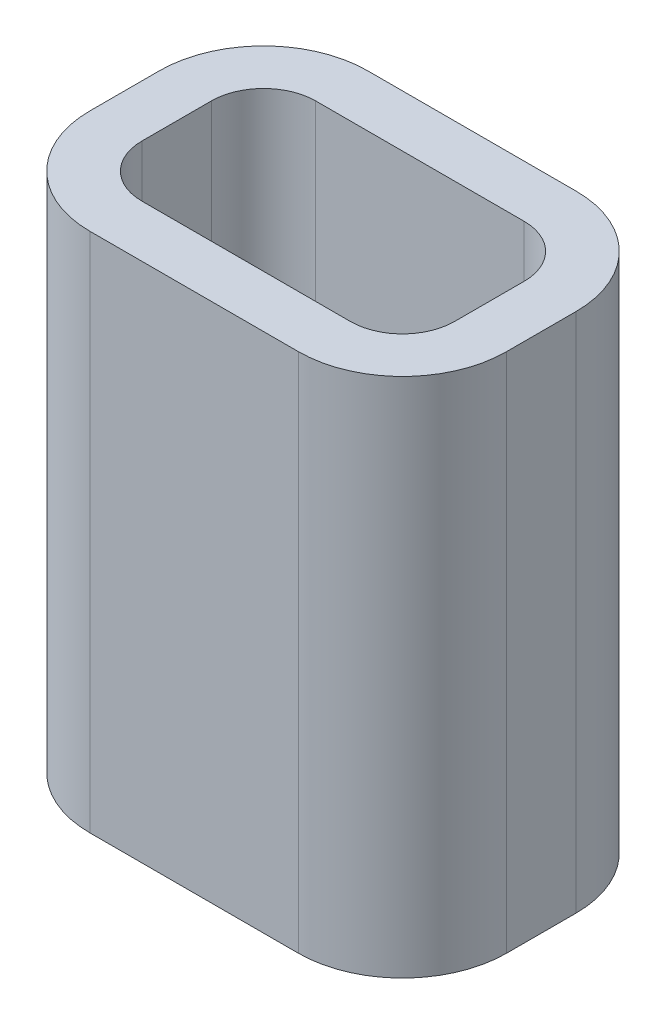
ISO-10303-21;
HEADER;
FILE_DESCRIPTION(('STEP AP214'),'2;1');
FILE_NAME('part.step','',(''),(''),'','','');
FILE_SCHEMA(('AUTOMOTIVE_DESIGN { 1 0 10303 214 1 1 1 1 }'));
ENDSEC;
DATA;
#1=APPLICATION_CONTEXT('core data for automotive mechanical design processes');
#2=APPLICATION_PROTOCOL_DEFINITION('international standard','automotive_design',2000,#1);
#3=PRODUCT_CONTEXT('',#1,'mechanical');
#4=PRODUCT('Part','Part','',(#3));
#5=PRODUCT_RELATED_PRODUCT_CATEGORY('part','',(#4));
#6=PRODUCT_DEFINITION_FORMATION('','',#4);
#7=PRODUCT_DEFINITION_CONTEXT('part definition',#1,'design');
#8=PRODUCT_DEFINITION('design','',#6,#7);
#9=PRODUCT_DEFINITION_SHAPE('','',#8);
#10=(LENGTH_UNIT() NAMED_UNIT(*) SI_UNIT(.MILLI.,.METRE.));
#11=(NAMED_UNIT(*) PLANE_ANGLE_UNIT() SI_UNIT($,.RADIAN.));
#12=(NAMED_UNIT(*) SI_UNIT($,.STERADIAN.) SOLID_ANGLE_UNIT());
#13=UNCERTAINTY_MEASURE_WITH_UNIT(LENGTH_MEASURE(1.E-05),#10,'distance_accuracy_value','');
#14=(GEOMETRIC_REPRESENTATION_CONTEXT(3) GLOBAL_UNCERTAINTY_ASSIGNED_CONTEXT((#13)) GLOBAL_UNIT_ASSIGNED_CONTEXT((#10,
#11,#12)) REPRESENTATION_CONTEXT('',''));
#15=CARTESIAN_POINT('',(0.,0.,0.));
#16=DIRECTION('',(0.,0.,1.));
#17=DIRECTION('',(1.,0.,0.));
#18=AXIS2_PLACEMENT_3D('',#15,#16,#17);
#19=CARTESIAN_POINT('',(6.00000000000001,30.,-2.));
#20=DIRECTION('',(0.,-1.,0.));
#21=DIRECTION('',(0.,0.,-1.));
#22=AXIS2_PLACEMENT_3D('',#19,#20,#21);
#23=CYLINDRICAL_SURFACE('',#22,3.);
#24=DIRECTION('',(0.,-1.,0.));
#25=VECTOR('',#24,1.);
#26=CARTESIAN_POINT('',(5.99999999999999,30.,-5.));
#27=LINE('',#26,#25);
#28=CARTESIAN_POINT('',(5.99999999999999,30.,-5.));
#29=VERTEX_POINT('',#28);
#30=CARTESIAN_POINT('',(5.99999999999999,1.,-5.));
#31=VERTEX_POINT('',#30);
#32=EDGE_CURVE('E188',#29,#31,#27,.T.);
#33=ORIENTED_EDGE('',*,*,#32,.T.);
#34=CARTESIAN_POINT('',(6.00000000000001,1.,-2.));
#35=DIRECTION('',(0.,-1.,0.));
#36=DIRECTION('',(0.,0.,-1.));
#37=AXIS2_PLACEMENT_3D('',#34,#35,#36);
#38=CIRCLE('',#37,3.);
#39=CARTESIAN_POINT('',(9.00000000000001,1.,-1.99999999999998));
#40=VERTEX_POINT('',#39);
#41=EDGE_CURVE('E176',#31,#40,#38,.T.);
#42=ORIENTED_EDGE('',*,*,#41,.T.);
#43=DIRECTION('',(0.,-1.,0.));
#44=VECTOR('',#43,1.);
#45=CARTESIAN_POINT('',(9.00000000000001,30.,-1.99999999999998));
#46=LINE('',#45,#44);
#47=CARTESIAN_POINT('',(9.00000000000001,30.,-1.99999999999998));
#48=VERTEX_POINT('',#47);
#49=EDGE_CURVE('E185',#48,#40,#46,.T.);
#50=ORIENTED_EDGE('',*,*,#49,.F.);
#51=CARTESIAN_POINT('',(6.00000000000001,30.,-2.));
#52=DIRECTION('',(0.,1.,0.));
#53=DIRECTION('',(0.,0.,-1.));
#54=AXIS2_PLACEMENT_3D('',#51,#52,#53);
#55=CIRCLE('',#54,3.);
#56=EDGE_CURVE('E390',#48,#29,#55,.T.);
#57=ORIENTED_EDGE('',*,*,#56,.T.);
#58=EDGE_LOOP('',(#33,#42,#50,#57));
#59=FACE_BOUND('',#58,.T.);
#60=ADVANCED_FACE('F39',(#59),#23,.F.);
#61=CARTESIAN_POINT('',(-5.99999999999997,30.,-5.));
#62=DIRECTION('',(0.,0.,1.));
#63=DIRECTION('',(1.,0.,0.));
#64=AXIS2_PLACEMENT_3D('',#61,#62,#63);
#65=PLANE('',#64);
#66=DIRECTION('',(0.,-1.,0.));
#67=VECTOR('',#66,1.);
#68=CARTESIAN_POINT('',(-5.99999999999997,30.,-5.));
#69=LINE('',#68,#67);
#70=CARTESIAN_POINT('',(-5.99999999999997,30.,-5.));
#71=VERTEX_POINT('',#70);
#72=CARTESIAN_POINT('',(-5.99999999999997,1.,-5.));
#73=VERTEX_POINT('',#72);
#74=EDGE_CURVE('E212',#71,#73,#69,.T.);
#75=ORIENTED_EDGE('',*,*,#74,.T.);
#76=DIRECTION('',(1.,0.,0.));
#77=VECTOR('',#76,1.);
#78=CARTESIAN_POINT('',(5.99999999999999,1.,-5.));
#79=LINE('',#78,#77);
#80=EDGE_CURVE('E416',#73,#31,#79,.T.);
#81=ORIENTED_EDGE('',*,*,#80,.T.);
#82=ORIENTED_EDGE('',*,*,#32,.F.);
#83=DIRECTION('',(-1.,0.,0.));
#84=VECTOR('',#83,1.);
#85=CARTESIAN_POINT('',(-5.99999999999997,30.,-5.));
#86=LINE('',#85,#84);
#87=EDGE_CURVE('E383',#29,#71,#86,.T.);
#88=ORIENTED_EDGE('',*,*,#87,.T.);
#89=EDGE_LOOP('',(#75,#81,#82,#88));
#90=FACE_BOUND('',#89,.T.);
#91=ADVANCED_FACE('F320',(#90),#65,.T.);
#92=CARTESIAN_POINT('',(-5.99999999999999,30.,-2.));
#93=DIRECTION('',(0.,-1.,0.));
#94=DIRECTION('',(0.,0.,-1.));
#95=AXIS2_PLACEMENT_3D('',#92,#93,#94);
#96=CYLINDRICAL_SURFACE('',#95,3.);
#97=DIRECTION('',(0.,-1.,0.));
#98=VECTOR('',#97,1.);
#99=CARTESIAN_POINT('',(-8.99999999999999,30.,-1.99999999999998));
#100=LINE('',#99,#98);
#101=CARTESIAN_POINT('',(-8.99999999999999,30.,-1.99999999999998));
#102=VERTEX_POINT('',#101);
#103=CARTESIAN_POINT('',(-8.99999999999999,1.,-1.99999999999998));
#104=VERTEX_POINT('',#103);
#105=EDGE_CURVE('E209',#102,#104,#100,.T.);
#106=ORIENTED_EDGE('',*,*,#105,.T.);
#107=CARTESIAN_POINT('',(-5.99999999999999,1.,-2.));
#108=DIRECTION('',(0.,-1.,0.));
#109=DIRECTION('',(0.,0.,-1.));
#110=AXIS2_PLACEMENT_3D('',#107,#108,#109);
#111=CIRCLE('',#110,3.);
#112=EDGE_CURVE('E368',#104,#73,#111,.T.);
#113=ORIENTED_EDGE('',*,*,#112,.T.);
#114=ORIENTED_EDGE('',*,*,#74,.F.);
#115=CARTESIAN_POINT('',(-5.99999999999999,30.,-2.));
#116=DIRECTION('',(0.,1.,0.));
#117=DIRECTION('',(0.,0.,-1.));
#118=AXIS2_PLACEMENT_3D('',#115,#116,#117);
#119=CIRCLE('',#118,3.);
#120=EDGE_CURVE('E370',#71,#102,#119,.T.);
#121=ORIENTED_EDGE('',*,*,#120,.T.);
#122=EDGE_LOOP('',(#106,#113,#114,#121));
#123=FACE_BOUND('',#122,.T.);
#124=ADVANCED_FACE('F326',(#123),#96,.F.);
#125=CARTESIAN_POINT('',(-8.99999999999999,30.,1.99999999999998));
#126=DIRECTION('',(1.,0.,0.));
#127=DIRECTION('',(0.,0.,-1.));
#128=AXIS2_PLACEMENT_3D('',#125,#126,#127);
#129=PLANE('',#128);
#130=DIRECTION('',(0.,-1.,0.));
#131=VECTOR('',#130,1.);
#132=CARTESIAN_POINT('',(-8.99999999999999,30.,1.99999999999998));
#133=LINE('',#132,#131);
#134=CARTESIAN_POINT('',(-8.99999999999999,30.,1.99999999999998));
#135=VERTEX_POINT('',#134);
#136=CARTESIAN_POINT('',(-8.99999999999999,1.,1.99999999999998));
#137=VERTEX_POINT('',#136);
#138=EDGE_CURVE('E206',#135,#137,#133,.T.);
#139=ORIENTED_EDGE('',*,*,#138,.T.);
#140=DIRECTION('',(0.,0.,-1.));
#141=VECTOR('',#140,1.);
#142=CARTESIAN_POINT('',(-8.99999999999999,1.,-1.99999999999998));
#143=LINE('',#142,#141);
#144=EDGE_CURVE('E375',#137,#104,#143,.T.);
#145=ORIENTED_EDGE('',*,*,#144,.T.);
#146=ORIENTED_EDGE('',*,*,#105,.F.);
#147=DIRECTION('',(0.,0.,1.));
#148=VECTOR('',#147,1.);
#149=CARTESIAN_POINT('',(-8.99999999999999,30.,1.99999999999998));
#150=LINE('',#149,#148);
#151=EDGE_CURVE('E373',#102,#135,#150,.T.);
#152=ORIENTED_EDGE('',*,*,#151,.T.);
#153=EDGE_LOOP('',(#139,#145,#146,#152));
#154=FACE_BOUND('',#153,.T.);
#155=ADVANCED_FACE('F357',(#154),#129,.T.);
#156=CARTESIAN_POINT('',(-5.99999999999999,30.,2.));
#157=DIRECTION('',(0.,-1.,0.));
#158=DIRECTION('',(0.,0.,-1.));
#159=AXIS2_PLACEMENT_3D('',#156,#157,#158);
#160=CYLINDRICAL_SURFACE('',#159,3.);
#161=DIRECTION('',(0.,-1.,0.));
#162=VECTOR('',#161,1.);
#163=CARTESIAN_POINT('',(-5.99999999999997,30.,5.));
#164=LINE('',#163,#162);
#165=CARTESIAN_POINT('',(-5.99999999999997,30.,5.));
#166=VERTEX_POINT('',#165);
#167=CARTESIAN_POINT('',(-5.99999999999997,1.,5.));
#168=VERTEX_POINT('',#167);
#169=EDGE_CURVE('E203',#166,#168,#164,.T.);
#170=ORIENTED_EDGE('',*,*,#169,.T.);
#171=CARTESIAN_POINT('',(-5.99999999999999,1.,2.));
#172=DIRECTION('',(0.,-1.,0.));
#173=DIRECTION('',(0.,0.,-1.));
#174=AXIS2_PLACEMENT_3D('',#171,#172,#173);
#175=CIRCLE('',#174,3.);
#176=EDGE_CURVE('E427',#168,#137,#175,.T.);
#177=ORIENTED_EDGE('',*,*,#176,.T.);
#178=ORIENTED_EDGE('',*,*,#138,.F.);
#179=CARTESIAN_POINT('',(-5.99999999999999,30.,2.));
#180=DIRECTION('',(0.,1.,0.));
#181=DIRECTION('',(0.,0.,-1.));
#182=AXIS2_PLACEMENT_3D('',#179,#180,#181);
#183=CIRCLE('',#182,3.);
#184=EDGE_CURVE('E379',#135,#166,#183,.T.);
#185=ORIENTED_EDGE('',*,*,#184,.T.);
#186=EDGE_LOOP('',(#170,#177,#178,#185));
#187=FACE_BOUND('',#186,.T.);
#188=ADVANCED_FACE('F353',(#187),#160,.F.);
#189=CARTESIAN_POINT('',(-5.99999999999997,30.,5.));
#190=DIRECTION('',(0.,0.,-1.));
#191=DIRECTION('',(-1.,0.,0.));
#192=AXIS2_PLACEMENT_3D('',#189,#190,#191);
#193=PLANE('',#192);
#194=DIRECTION('',(0.,-1.,0.));
#195=VECTOR('',#194,1.);
#196=CARTESIAN_POINT('',(5.99999999999999,30.,5.));
#197=LINE('',#196,#195);
#198=CARTESIAN_POINT('',(5.99999999999999,30.,5.));
#199=VERTEX_POINT('',#198);
#200=CARTESIAN_POINT('',(5.99999999999999,1.,5.));
#201=VERTEX_POINT('',#200);
#202=EDGE_CURVE('E195',#199,#201,#197,.T.);
#203=ORIENTED_EDGE('',*,*,#202,.T.);
#204=DIRECTION('',(-1.,0.,0.));
#205=VECTOR('',#204,1.);
#206=CARTESIAN_POINT('',(-5.99999999999997,1.,5.));
#207=LINE('',#206,#205);
#208=EDGE_CURVE('E430',#201,#168,#207,.T.);
#209=ORIENTED_EDGE('',*,*,#208,.T.);
#210=ORIENTED_EDGE('',*,*,#169,.F.);
#211=DIRECTION('',(1.,0.,0.));
#212=VECTOR('',#211,1.);
#213=CARTESIAN_POINT('',(-5.99999999999997,30.,5.));
#214=LINE('',#213,#212);
#215=EDGE_CURVE('E381',#166,#199,#214,.T.);
#216=ORIENTED_EDGE('',*,*,#215,.T.);
#217=EDGE_LOOP('',(#203,#209,#210,#216));
#218=FACE_BOUND('',#217,.T.);
#219=ADVANCED_FACE('F345',(#218),#193,.T.);
#220=CARTESIAN_POINT('',(6.00000000000001,30.,2.));
#221=DIRECTION('',(0.,-1.,0.));
#222=DIRECTION('',(0.,0.,-1.));
#223=AXIS2_PLACEMENT_3D('',#220,#221,#222);
#224=CYLINDRICAL_SURFACE('',#223,3.);
#225=DIRECTION('',(0.,-1.,0.));
#226=VECTOR('',#225,1.);
#227=CARTESIAN_POINT('',(9.00000000000001,30.,1.99999999999998));
#228=LINE('',#227,#226);
#229=CARTESIAN_POINT('',(9.00000000000001,30.,1.99999999999998));
#230=VERTEX_POINT('',#229);
#231=CARTESIAN_POINT('',(9.00000000000001,1.,1.99999999999998));
#232=VERTEX_POINT('',#231);
#233=EDGE_CURVE('E193',#230,#232,#228,.T.);
#234=ORIENTED_EDGE('',*,*,#233,.T.);
#235=CARTESIAN_POINT('',(6.00000000000001,1.,2.));
#236=DIRECTION('',(0.,-1.,0.));
#237=DIRECTION('',(0.,0.,-1.));
#238=AXIS2_PLACEMENT_3D('',#235,#236,#237);
#239=CIRCLE('',#238,3.);
#240=EDGE_CURVE('E54',#232,#201,#239,.T.);
#241=ORIENTED_EDGE('',*,*,#240,.T.);
#242=ORIENTED_EDGE('',*,*,#202,.F.);
#243=CARTESIAN_POINT('',(6.00000000000001,30.,2.));
#244=DIRECTION('',(0.,1.,0.));
#245=DIRECTION('',(0.,0.,1.));
#246=AXIS2_PLACEMENT_3D('',#243,#244,#245);
#247=CIRCLE('',#246,3.);
#248=EDGE_CURVE('E197',#199,#230,#247,.T.);
#249=ORIENTED_EDGE('',*,*,#248,.T.);
#250=EDGE_LOOP('',(#234,#241,#242,#249));
#251=FACE_BOUND('',#250,.T.);
#252=ADVANCED_FACE('F340',(#251),#224,.F.);
#253=CARTESIAN_POINT('',(9.00000000000001,30.,1.99999999999998));
#254=DIRECTION('',(-1.,0.,0.));
#255=DIRECTION('',(0.,0.,1.));
#256=AXIS2_PLACEMENT_3D('',#253,#254,#255);
#257=PLANE('',#256);
#258=ORIENTED_EDGE('',*,*,#49,.T.);
#259=DIRECTION('',(0.,0.,1.));
#260=VECTOR('',#259,1.);
#261=CARTESIAN_POINT('',(9.00000000000001,1.,1.99999999999998));
#262=LINE('',#261,#260);
#263=EDGE_CURVE('E173',#40,#232,#262,.T.);
#264=ORIENTED_EDGE('',*,*,#263,.T.);
#265=ORIENTED_EDGE('',*,*,#233,.F.);
#266=DIRECTION('',(0.,0.,-1.));
#267=VECTOR('',#266,1.);
#268=CARTESIAN_POINT('',(9.00000000000001,30.,1.99999999999998));
#269=LINE('',#268,#267);
#270=EDGE_CURVE('E192',#230,#48,#269,.T.);
#271=ORIENTED_EDGE('',*,*,#270,.T.);
#272=EDGE_LOOP('',(#258,#264,#265,#271));
#273=FACE_BOUND('',#272,.T.);
#274=ADVANCED_FACE('F190',(#273),#257,.T.);
#275=CARTESIAN_POINT('',(-5.99999999999997,30.,-8.));
#276=DIRECTION('',(0.,0.,1.));
#277=DIRECTION('',(1.,0.,0.));
#278=AXIS2_PLACEMENT_3D('',#275,#276,#277);
#279=PLANE('',#278);
#280=DIRECTION('',(-1.,0.,0.));
#281=VECTOR('',#280,1.);
#282=CARTESIAN_POINT('',(-5.99999999999997,0.,-8.));
#283=LINE('',#282,#281);
#284=CARTESIAN_POINT('',(5.99999999999999,0.,-8.));
#285=VERTEX_POINT('',#284);
#286=CARTESIAN_POINT('',(-5.99999999999997,0.,-8.));
#287=VERTEX_POINT('',#286);
#288=EDGE_CURVE('E221',#285,#287,#283,.T.);
#289=ORIENTED_EDGE('',*,*,#288,.T.);
#290=DIRECTION('',(0.,-1.,0.));
#291=VECTOR('',#290,1.);
#292=CARTESIAN_POINT('',(-5.99999999999997,30.,-8.));
#293=LINE('',#292,#291);
#294=CARTESIAN_POINT('',(-5.99999999999997,30.,-8.));
#295=VERTEX_POINT('',#294);
#296=EDGE_CURVE('E235',#295,#287,#293,.T.);
#297=ORIENTED_EDGE('',*,*,#296,.F.);
#298=DIRECTION('',(-1.,0.,0.));
#299=VECTOR('',#298,1.);
#300=CARTESIAN_POINT('',(-5.99999999999997,30.,-8.));
#301=LINE('',#300,#299);
#302=CARTESIAN_POINT('',(5.99999999999999,30.,-8.));
#303=VERTEX_POINT('',#302);
#304=EDGE_CURVE('E233',#303,#295,#301,.T.);
#305=ORIENTED_EDGE('',*,*,#304,.F.);
#306=DIRECTION('',(0.,-1.,0.));
#307=VECTOR('',#306,1.);
#308=CARTESIAN_POINT('',(5.99999999999999,30.,-8.));
#309=LINE('',#308,#307);
#310=EDGE_CURVE('E253',#303,#285,#309,.T.);
#311=ORIENTED_EDGE('',*,*,#310,.T.);
#312=EDGE_LOOP('',(#289,#297,#305,#311));
#313=FACE_BOUND('',#312,.T.);
#314=DIRECTION('',(0.,1.,0.));
#315=VECTOR('',#314,1.);
#316=CARTESIAN_POINT('',(-2.44675047994337,12.9910890796254,-8.));
#317=LINE('',#316,#315);
#318=CARTESIAN_POINT('',(-2.44675047994337,12.9910890796254,-8.));
#319=VERTEX_POINT('',#318);
#320=CARTESIAN_POINT('',(-2.44675047994337,17.0089109203746,-8.));
#321=VERTEX_POINT('',#320);
#322=EDGE_CURVE('E413',#319,#321,#317,.T.);
#323=ORIENTED_EDGE('',*,*,#322,.F.);
#324=DIRECTION('',(-1.,0.,0.));
#325=VECTOR('',#324,1.);
#326=CARTESIAN_POINT('',(2.44675047994337,12.9910890796254,-8.));
#327=LINE('',#326,#325);
#328=CARTESIAN_POINT('',(2.44675047994337,12.9910890796254,-8.));
#329=VERTEX_POINT('',#328);
#330=EDGE_CURVE('E405',#329,#319,#327,.T.);
#331=ORIENTED_EDGE('',*,*,#330,.F.);
#332=DIRECTION('',(0.,-1.,0.));
#333=VECTOR('',#332,1.);
#334=CARTESIAN_POINT('',(2.44675047994337,12.9910890796254,-8.));
#335=LINE('',#334,#333);
#336=CARTESIAN_POINT('',(2.44675047994337,17.0089109203746,-8.));
#337=VERTEX_POINT('',#336);
#338=EDGE_CURVE('E409',#337,#329,#335,.T.);
#339=ORIENTED_EDGE('',*,*,#338,.F.);
#340=DIRECTION('',(1.,0.,0.));
#341=VECTOR('',#340,1.);
#342=CARTESIAN_POINT('',(2.44675047994337,17.0089109203746,-8.));
#343=LINE('',#342,#341);
#344=EDGE_CURVE('E62',#321,#337,#343,.T.);
#345=ORIENTED_EDGE('',*,*,#344,.F.);
#346=EDGE_LOOP('',(#323,#331,#339,#345));
#347=FACE_BOUND('',#346,.T.);
#348=ADVANCED_FACE('F302',(#313,#347),#279,.F.);
#349=CARTESIAN_POINT('',(-5.99999999999999,30.,-2.));
#350=DIRECTION('',(0.,-1.,0.));
#351=DIRECTION('',(0.,0.,-1.));
#352=AXIS2_PLACEMENT_3D('',#349,#350,#351);
#353=PLANE('',#352);
#354=CARTESIAN_POINT('',(-5.99999999999999,30.,-2.));
#355=DIRECTION('',(0.,1.,0.));
#356=DIRECTION('',(0.,0.,-1.));
#357=AXIS2_PLACEMENT_3D('',#354,#355,#356);
#358=CIRCLE('',#357,6.);
#359=CARTESIAN_POINT('',(-12.,30.,-1.99999999999998));
#360=VERTEX_POINT('',#359);
#361=EDGE_CURVE('E217',#295,#360,#358,.T.);
#362=ORIENTED_EDGE('',*,*,#361,.T.);
#363=DIRECTION('',(0.,0.,1.));
#364=VECTOR('',#363,1.);
#365=CARTESIAN_POINT('',(-12.,30.,1.99999999999996));
#366=LINE('',#365,#364);
#367=CARTESIAN_POINT('',(-12.,30.,1.99999999999996));
#368=VERTEX_POINT('',#367);
#369=EDGE_CURVE('E220',#360,#368,#366,.T.);
#370=ORIENTED_EDGE('',*,*,#369,.T.);
#371=CARTESIAN_POINT('',(-5.99999999999999,30.,2.));
#372=DIRECTION('',(0.,1.,0.));
#373=DIRECTION('',(0.,0.,-1.));
#374=AXIS2_PLACEMENT_3D('',#371,#372,#373);
#375=CIRCLE('',#374,6.);
#376=CARTESIAN_POINT('',(-5.99999999999997,30.,8.));
#377=VERTEX_POINT('',#376);
#378=EDGE_CURVE('E223',#368,#377,#375,.T.);
#379=ORIENTED_EDGE('',*,*,#378,.T.);
#380=DIRECTION('',(1.,0.,0.));
#381=VECTOR('',#380,1.);
#382=CARTESIAN_POINT('',(-5.99999999999997,30.,8.));
#383=LINE('',#382,#381);
#384=CARTESIAN_POINT('',(5.99999999999997,30.,8.));
#385=VERTEX_POINT('',#384);
#386=EDGE_CURVE('E225',#377,#385,#383,.T.);
#387=ORIENTED_EDGE('',*,*,#386,.T.);
#388=CARTESIAN_POINT('',(6.00000000000001,30.,2.));
#389=DIRECTION('',(0.,1.,0.));
#390=DIRECTION('',(0.,0.,1.));
#391=AXIS2_PLACEMENT_3D('',#388,#389,#390);
#392=CIRCLE('',#391,6.);
#393=CARTESIAN_POINT('',(12.,30.,1.99999999999998));
#394=VERTEX_POINT('',#393);
#395=EDGE_CURVE('E227',#385,#394,#392,.T.);
#396=ORIENTED_EDGE('',*,*,#395,.T.);
#397=DIRECTION('',(0.,0.,-1.));
#398=VECTOR('',#397,1.);
#399=CARTESIAN_POINT('',(12.,30.,1.99999999999998));
#400=LINE('',#399,#398);
#401=CARTESIAN_POINT('',(12.,30.,-1.99999999999996));
#402=VERTEX_POINT('',#401);
#403=EDGE_CURVE('E229',#394,#402,#400,.T.);
#404=ORIENTED_EDGE('',*,*,#403,.T.);
#405=CARTESIAN_POINT('',(6.00000000000001,30.,-2.));
#406=DIRECTION('',(0.,1.,0.));
#407=DIRECTION('',(0.,0.,-1.));
#408=AXIS2_PLACEMENT_3D('',#405,#406,#407);
#409=CIRCLE('',#408,6.);
#410=EDGE_CURVE('E231',#402,#303,#409,.T.);
#411=ORIENTED_EDGE('',*,*,#410,.T.);
#412=ORIENTED_EDGE('',*,*,#304,.T.);
#413=EDGE_LOOP('',(#362,#370,#379,#387,#396,#404,#411,#412));
#414=FACE_BOUND('',#413,.T.);
#415=ORIENTED_EDGE('',*,*,#56,.F.);
#416=ORIENTED_EDGE('',*,*,#270,.F.);
#417=ORIENTED_EDGE('',*,*,#248,.F.);
#418=ORIENTED_EDGE('',*,*,#215,.F.);
#419=ORIENTED_EDGE('',*,*,#184,.F.);
#420=ORIENTED_EDGE('',*,*,#151,.F.);
#421=ORIENTED_EDGE('',*,*,#120,.F.);
#422=ORIENTED_EDGE('',*,*,#87,.F.);
#423=EDGE_LOOP('',(#415,#416,#417,#418,#419,#420,#421,#422));
#424=FACE_BOUND('',#423,.T.);
#425=ADVANCED_FACE('F291',(#414,#424),#353,.F.);
#426=CARTESIAN_POINT('',(-5.99999999999999,0.,-2.));
#427=DIRECTION('',(0.,-1.,0.));
#428=DIRECTION('',(0.,0.,-1.));
#429=AXIS2_PLACEMENT_3D('',#426,#427,#428);
#430=PLANE('',#429);
#431=CARTESIAN_POINT('',(-5.99999999999999,0.,-2.));
#432=DIRECTION('',(0.,1.,0.));
#433=DIRECTION('',(0.,0.,-1.));
#434=AXIS2_PLACEMENT_3D('',#431,#432,#433);
#435=CIRCLE('',#434,6.);
#436=CARTESIAN_POINT('',(-12.,0.,-1.99999999999998));
#437=VERTEX_POINT('',#436);
#438=EDGE_CURVE('E216',#287,#437,#435,.T.);
#439=ORIENTED_EDGE('',*,*,#438,.F.);
#440=ORIENTED_EDGE('',*,*,#288,.F.);
#441=CARTESIAN_POINT('',(6.00000000000001,0.,-2.));
#442=DIRECTION('',(0.,1.,0.));
#443=DIRECTION('',(0.,0.,-1.));
#444=AXIS2_PLACEMENT_3D('',#441,#442,#443);
#445=CIRCLE('',#444,6.);
#446=CARTESIAN_POINT('',(12.,0.,-1.99999999999996));
#447=VERTEX_POINT('',#446);
#448=EDGE_CURVE('E248',#447,#285,#445,.T.);
#449=ORIENTED_EDGE('',*,*,#448,.F.);
#450=DIRECTION('',(0.,0.,-1.));
#451=VECTOR('',#450,1.);
#452=CARTESIAN_POINT('',(12.,0.,1.99999999999998));
#453=LINE('',#452,#451);
#454=CARTESIAN_POINT('',(12.,0.,1.99999999999998));
#455=VERTEX_POINT('',#454);
#456=EDGE_CURVE('E246',#455,#447,#453,.T.);
#457=ORIENTED_EDGE('',*,*,#456,.F.);
#458=CARTESIAN_POINT('',(6.00000000000001,0.,2.));
#459=DIRECTION('',(0.,1.,0.));
#460=DIRECTION('',(0.,0.,1.));
#461=AXIS2_PLACEMENT_3D('',#458,#459,#460);
#462=CIRCLE('',#461,6.);
#463=CARTESIAN_POINT('',(5.99999999999997,0.,8.));
#464=VERTEX_POINT('',#463);
#465=EDGE_CURVE('E244',#464,#455,#462,.T.);
#466=ORIENTED_EDGE('',*,*,#465,.F.);
#467=DIRECTION('',(1.,0.,0.));
#468=VECTOR('',#467,1.);
#469=CARTESIAN_POINT('',(-5.99999999999997,0.,8.));
#470=LINE('',#469,#468);
#471=CARTESIAN_POINT('',(-5.99999999999997,0.,8.));
#472=VERTEX_POINT('',#471);
#473=EDGE_CURVE('E242',#472,#464,#470,.T.);
#474=ORIENTED_EDGE('',*,*,#473,.F.);
#475=CARTESIAN_POINT('',(-5.99999999999999,0.,2.));
#476=DIRECTION('',(0.,1.,0.));
#477=DIRECTION('',(0.,0.,-1.));
#478=AXIS2_PLACEMENT_3D('',#475,#476,#477);
#479=CIRCLE('',#478,6.);
#480=CARTESIAN_POINT('',(-12.,0.,1.99999999999996));
#481=VERTEX_POINT('',#480);
#482=EDGE_CURVE('E240',#481,#472,#479,.T.);
#483=ORIENTED_EDGE('',*,*,#482,.F.);
#484=DIRECTION('',(0.,0.,1.));
#485=VECTOR('',#484,1.);
#486=CARTESIAN_POINT('',(-12.,0.,1.99999999999996));
#487=LINE('',#486,#485);
#488=EDGE_CURVE('E238',#437,#481,#487,.T.);
#489=ORIENTED_EDGE('',*,*,#488,.F.);
#490=EDGE_LOOP('',(#439,#440,#449,#457,#466,#474,#483,#489));
#491=FACE_BOUND('',#490,.T.);
#492=ADVANCED_FACE('F278',(#491),#430,.T.);
#493=CARTESIAN_POINT('',(-5.99999999999999,30.,-2.));
#494=DIRECTION('',(0.,-1.,0.));
#495=DIRECTION('',(0.,0.,-1.));
#496=AXIS2_PLACEMENT_3D('',#493,#494,#495);
#497=CYLINDRICAL_SURFACE('',#496,6.);
#498=ORIENTED_EDGE('',*,*,#438,.T.);
#499=DIRECTION('',(0.,-1.,0.));
#500=VECTOR('',#499,1.);
#501=CARTESIAN_POINT('',(-12.,30.,-1.99999999999998));
#502=LINE('',#501,#500);
#503=EDGE_CURVE('E11',#360,#437,#502,.T.);
#504=ORIENTED_EDGE('',*,*,#503,.F.);
#505=ORIENTED_EDGE('',*,*,#361,.F.);
#506=ORIENTED_EDGE('',*,*,#296,.T.);
#507=EDGE_LOOP('',(#498,#504,#505,#506));
#508=FACE_BOUND('',#507,.T.);
#509=ADVANCED_FACE('F41',(#508),#497,.T.);
#510=CARTESIAN_POINT('',(-12.,30.,1.99999999999996));
#511=DIRECTION('',(1.,0.,0.));
#512=DIRECTION('',(0.,0.,-1.));
#513=AXIS2_PLACEMENT_3D('',#510,#511,#512);
#514=PLANE('',#513);
#515=ORIENTED_EDGE('',*,*,#488,.T.);
#516=DIRECTION('',(0.,-1.,0.));
#517=VECTOR('',#516,1.);
#518=CARTESIAN_POINT('',(-12.,30.,1.99999999999996));
#519=LINE('',#518,#517);
#520=EDGE_CURVE('E47',#368,#481,#519,.T.);
#521=ORIENTED_EDGE('',*,*,#520,.F.);
#522=ORIENTED_EDGE('',*,*,#369,.F.);
#523=ORIENTED_EDGE('',*,*,#503,.T.);
#524=EDGE_LOOP('',(#515,#521,#522,#523));
#525=FACE_BOUND('',#524,.T.);
#526=ADVANCED_FACE('F296',(#525),#514,.F.);
#527=CARTESIAN_POINT('',(-5.99999999999999,30.,2.));
#528=DIRECTION('',(0.,-1.,0.));
#529=DIRECTION('',(0.,0.,-1.));
#530=AXIS2_PLACEMENT_3D('',#527,#528,#529);
#531=CYLINDRICAL_SURFACE('',#530,6.);
#532=ORIENTED_EDGE('',*,*,#482,.T.);
#533=DIRECTION('',(0.,-1.,0.));
#534=VECTOR('',#533,1.);
#535=CARTESIAN_POINT('',(-5.99999999999997,30.,8.));
#536=LINE('',#535,#534);
#537=EDGE_CURVE('E265',#377,#472,#536,.T.);
#538=ORIENTED_EDGE('',*,*,#537,.F.);
#539=ORIENTED_EDGE('',*,*,#378,.F.);
#540=ORIENTED_EDGE('',*,*,#520,.T.);
#541=EDGE_LOOP('',(#532,#538,#539,#540));
#542=FACE_BOUND('',#541,.T.);
#543=ADVANCED_FACE('F272',(#542),#531,.T.);
#544=CARTESIAN_POINT('',(-5.99999999999997,30.,8.));
#545=DIRECTION('',(0.,0.,-1.));
#546=DIRECTION('',(-1.,0.,0.));
#547=AXIS2_PLACEMENT_3D('',#544,#545,#546);
#548=PLANE('',#547);
#549=ORIENTED_EDGE('',*,*,#473,.T.);
#550=DIRECTION('',(0.,-1.,0.));
#551=VECTOR('',#550,1.);
#552=CARTESIAN_POINT('',(5.99999999999997,30.,8.));
#553=LINE('',#552,#551);
#554=EDGE_CURVE('E262',#385,#464,#553,.T.);
#555=ORIENTED_EDGE('',*,*,#554,.F.);
#556=ORIENTED_EDGE('',*,*,#386,.F.);
#557=ORIENTED_EDGE('',*,*,#537,.T.);
#558=EDGE_LOOP('',(#549,#555,#556,#557));
#559=FACE_BOUND('',#558,.T.);
#560=ADVANCED_FACE('F283',(#559),#548,.F.);
#561=CARTESIAN_POINT('',(6.00000000000001,30.,2.));
#562=DIRECTION('',(0.,-1.,0.));
#563=DIRECTION('',(0.,0.,-1.));
#564=AXIS2_PLACEMENT_3D('',#561,#562,#563);
#565=CYLINDRICAL_SURFACE('',#564,6.);
#566=ORIENTED_EDGE('',*,*,#465,.T.);
#567=DIRECTION('',(0.,-1.,0.));
#568=VECTOR('',#567,1.);
#569=CARTESIAN_POINT('',(12.,30.,1.99999999999998));
#570=LINE('',#569,#568);
#571=EDGE_CURVE('E259',#394,#455,#570,.T.);
#572=ORIENTED_EDGE('',*,*,#571,.F.);
#573=ORIENTED_EDGE('',*,*,#395,.F.);
#574=ORIENTED_EDGE('',*,*,#554,.T.);
#575=EDGE_LOOP('',(#566,#572,#573,#574));
#576=FACE_BOUND('',#575,.T.);
#577=ADVANCED_FACE('F287',(#576),#565,.T.);
#578=CARTESIAN_POINT('',(12.,30.,1.99999999999998));
#579=DIRECTION('',(-1.,0.,0.));
#580=DIRECTION('',(0.,0.,1.));
#581=AXIS2_PLACEMENT_3D('',#578,#579,#580);
#582=PLANE('',#581);
#583=ORIENTED_EDGE('',*,*,#456,.T.);
#584=DIRECTION('',(0.,-1.,0.));
#585=VECTOR('',#584,1.);
#586=CARTESIAN_POINT('',(12.,30.,-1.99999999999996));
#587=LINE('',#586,#585);
#588=EDGE_CURVE('E256',#402,#447,#587,.T.);
#589=ORIENTED_EDGE('',*,*,#588,.F.);
#590=ORIENTED_EDGE('',*,*,#403,.F.);
#591=ORIENTED_EDGE('',*,*,#571,.T.);
#592=EDGE_LOOP('',(#583,#589,#590,#591));
#593=FACE_BOUND('',#592,.T.);
#594=ADVANCED_FACE('F309',(#593),#582,.F.);
#595=CARTESIAN_POINT('',(6.00000000000001,30.,-2.));
#596=DIRECTION('',(0.,-1.,0.));
#597=DIRECTION('',(0.,0.,-1.));
#598=AXIS2_PLACEMENT_3D('',#595,#596,#597);
#599=CYLINDRICAL_SURFACE('',#598,6.);
#600=ORIENTED_EDGE('',*,*,#448,.T.);
#601=ORIENTED_EDGE('',*,*,#310,.F.);
#602=ORIENTED_EDGE('',*,*,#410,.F.);
#603=ORIENTED_EDGE('',*,*,#588,.T.);
#604=EDGE_LOOP('',(#600,#601,#602,#603));
#605=FACE_BOUND('',#604,.T.);
#606=ADVANCED_FACE('F307',(#605),#599,.T.);
#607=CARTESIAN_POINT('',(-2.44675047994337,12.9910890796254,-11.));
#608=DIRECTION('',(1.,0.,0.));
#609=DIRECTION('',(0.,0.,-1.));
#610=AXIS2_PLACEMENT_3D('',#607,#608,#609);
#611=PLANE('',#610);
#612=ORIENTED_EDGE('',*,*,#322,.T.);
#613=DIRECTION('',(0.,0.,1.));
#614=VECTOR('',#613,1.);
#615=CARTESIAN_POINT('',(-2.44675047994337,17.0089109203746,-11.));
#616=LINE('',#615,#614);
#617=CARTESIAN_POINT('',(-2.44675047994337,17.0089109203746,-11.));
#618=VERTEX_POINT('',#617);
#619=EDGE_CURVE('E391',#618,#321,#616,.T.);
#620=ORIENTED_EDGE('',*,*,#619,.F.);
#621=DIRECTION('',(0.,1.,0.));
#622=VECTOR('',#621,1.);
#623=CARTESIAN_POINT('',(-2.44675047994337,12.9910890796254,-11.));
#624=LINE('',#623,#622);
#625=CARTESIAN_POINT('',(-2.44675047994337,12.9910890796254,-11.));
#626=VERTEX_POINT('',#625);
#627=EDGE_CURVE('E408',#626,#618,#624,.T.);
#628=ORIENTED_EDGE('',*,*,#627,.F.);
#629=DIRECTION('',(0.,0.,1.));
#630=VECTOR('',#629,1.);
#631=CARTESIAN_POINT('',(-2.44675047994337,12.9910890796254,-11.));
#632=LINE('',#631,#630);
#633=EDGE_CURVE('E401',#626,#319,#632,.T.);
#634=ORIENTED_EDGE('',*,*,#633,.T.);
#635=EDGE_LOOP('',(#612,#620,#628,#634));
#636=FACE_BOUND('',#635,.T.);
#637=ADVANCED_FACE('F316',(#636),#611,.F.);
#638=CARTESIAN_POINT('',(2.44675047994337,17.0089109203746,-11.));
#639=DIRECTION('',(0.,-1.,0.));
#640=DIRECTION('',(0.,0.,-1.));
#641=AXIS2_PLACEMENT_3D('',#638,#639,#640);
#642=PLANE('',#641);
#643=ORIENTED_EDGE('',*,*,#344,.T.);
#644=DIRECTION('',(0.,0.,1.));
#645=VECTOR('',#644,1.);
#646=CARTESIAN_POINT('',(2.44675047994337,17.0089109203746,-11.));
#647=LINE('',#646,#645);
#648=CARTESIAN_POINT('',(2.44675047994337,17.0089109203746,-11.));
#649=VERTEX_POINT('',#648);
#650=EDGE_CURVE('E393',#649,#337,#647,.T.);
#651=ORIENTED_EDGE('',*,*,#650,.F.);
#652=DIRECTION('',(1.,0.,0.));
#653=VECTOR('',#652,1.);
#654=CARTESIAN_POINT('',(2.44675047994337,17.0089109203746,-11.));
#655=LINE('',#654,#653);
#656=EDGE_CURVE('E420',#618,#649,#655,.T.);
#657=ORIENTED_EDGE('',*,*,#656,.F.);
#658=ORIENTED_EDGE('',*,*,#619,.T.);
#659=EDGE_LOOP('',(#643,#651,#657,#658));
#660=FACE_BOUND('',#659,.T.);
#661=ADVANCED_FACE('F443',(#660),#642,.F.);
#662=CARTESIAN_POINT('',(2.44675047994337,12.9910890796254,-11.));
#663=DIRECTION('',(-1.,0.,0.));
#664=DIRECTION('',(0.,0.,1.));
#665=AXIS2_PLACEMENT_3D('',#662,#663,#664);
#666=PLANE('',#665);
#667=ORIENTED_EDGE('',*,*,#338,.T.);
#668=DIRECTION('',(0.,0.,1.));
#669=VECTOR('',#668,1.);
#670=CARTESIAN_POINT('',(2.44675047994337,12.9910890796254,-11.));
#671=LINE('',#670,#669);
#672=CARTESIAN_POINT('',(2.44675047994337,12.9910890796254,-11.));
#673=VERTEX_POINT('',#672);
#674=EDGE_CURVE('E398',#673,#329,#671,.T.);
#675=ORIENTED_EDGE('',*,*,#674,.F.);
#676=DIRECTION('',(0.,-1.,0.));
#677=VECTOR('',#676,1.);
#678=CARTESIAN_POINT('',(2.44675047994337,12.9910890796254,-11.));
#679=LINE('',#678,#677);
#680=EDGE_CURVE('E418',#649,#673,#679,.T.);
#681=ORIENTED_EDGE('',*,*,#680,.F.);
#682=ORIENTED_EDGE('',*,*,#650,.T.);
#683=EDGE_LOOP('',(#667,#675,#681,#682));
#684=FACE_BOUND('',#683,.T.);
#685=ADVANCED_FACE('F447',(#684),#666,.F.);
#686=CARTESIAN_POINT('',(2.44675047994337,12.9910890796254,-11.));
#687=DIRECTION('',(0.,1.,0.));
#688=DIRECTION('',(0.,0.,1.));
#689=AXIS2_PLACEMENT_3D('',#686,#687,#688);
#690=PLANE('',#689);
#691=ORIENTED_EDGE('',*,*,#330,.T.);
#692=ORIENTED_EDGE('',*,*,#633,.F.);
#693=DIRECTION('',(-1.,0.,0.));
#694=VECTOR('',#693,1.);
#695=CARTESIAN_POINT('',(2.44675047994337,12.9910890796254,-11.));
#696=LINE('',#695,#694);
#697=EDGE_CURVE('E404',#673,#626,#696,.T.);
#698=ORIENTED_EDGE('',*,*,#697,.F.);
#699=ORIENTED_EDGE('',*,*,#674,.T.);
#700=EDGE_LOOP('',(#691,#692,#698,#699));
#701=FACE_BOUND('',#700,.T.);
#702=ADVANCED_FACE('F449',(#701),#690,.F.);
#703=CARTESIAN_POINT('',(0.,0.,-11.));
#704=DIRECTION('',(0.,0.,1.));
#705=DIRECTION('',(1.,0.,0.));
#706=AXIS2_PLACEMENT_3D('',#703,#704,#705);
#707=PLANE('',#706);
#708=ORIENTED_EDGE('',*,*,#627,.T.);
#709=ORIENTED_EDGE('',*,*,#656,.T.);
#710=ORIENTED_EDGE('',*,*,#680,.T.);
#711=ORIENTED_EDGE('',*,*,#697,.T.);
#712=EDGE_LOOP('',(#708,#709,#710,#711));
#713=FACE_BOUND('',#712,.T.);
#714=ADVANCED_FACE('F437',(#713),#707,.F.);
#715=CARTESIAN_POINT('',(6.00000000000001,1.,-2.));
#716=DIRECTION('',(0.,-1.,0.));
#717=DIRECTION('',(0.,0.,-1.));
#718=AXIS2_PLACEMENT_3D('',#715,#716,#717);
#719=PLANE('',#718);
#720=ORIENTED_EDGE('',*,*,#41,.F.);
#721=ORIENTED_EDGE('',*,*,#80,.F.);
#722=ORIENTED_EDGE('',*,*,#112,.F.);
#723=ORIENTED_EDGE('',*,*,#144,.F.);
#724=ORIENTED_EDGE('',*,*,#176,.F.);
#725=ORIENTED_EDGE('',*,*,#208,.F.);
#726=ORIENTED_EDGE('',*,*,#240,.F.);
#727=ORIENTED_EDGE('',*,*,#263,.F.);
#728=EDGE_LOOP('',(#720,#721,#722,#723,#724,#725,#726,#727));
#729=FACE_BOUND('',#728,.T.);
#730=ADVANCED_FACE('F175',(#729),#719,.F.);
#731=CLOSED_SHELL('',(#60,#91,#124,#155,#188,#219,#252,#274,#348,#425,#492,#509,#526,#543,#560,
#577,#594,#606,#637,#661,#685,#702,#714,#730));
#732=MANIFOLD_SOLID_BREP('B2',#731);
#733=ADVANCED_BREP_SHAPE_REPRESENTATION('',(#18,#732),#14);
#734=SHAPE_DEFINITION_REPRESENTATION(#9,#733);
ENDSEC;
END-ISO-10303-21;
